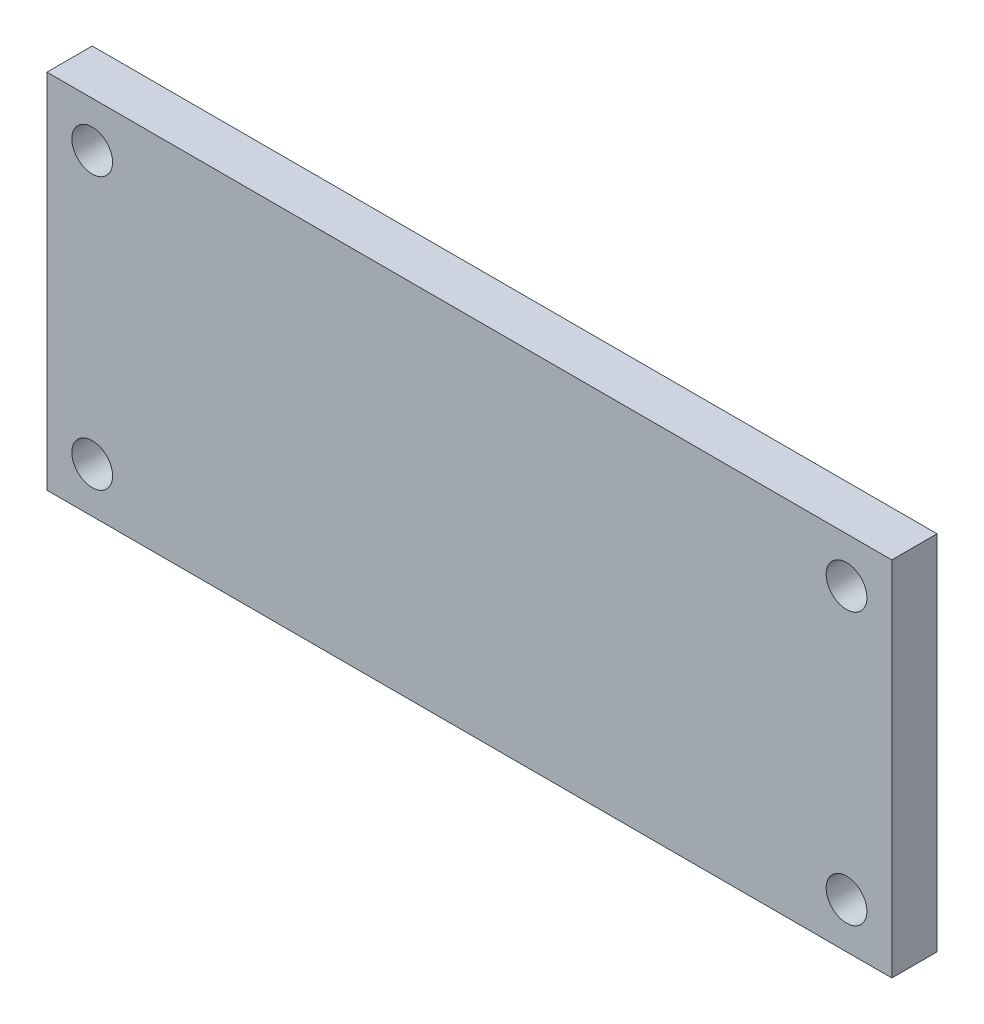
ISO-10303-21;
HEADER;
FILE_DESCRIPTION(('STEP AP214'),'2;1');
FILE_NAME('part.step','',(''),(''),'','','');
FILE_SCHEMA(('AUTOMOTIVE_DESIGN { 1 0 10303 214 1 1 1 1 }'));
ENDSEC;
DATA;
#1=APPLICATION_CONTEXT('core data for automotive mechanical design processes');
#2=APPLICATION_PROTOCOL_DEFINITION('international standard','automotive_design',2000,#1);
#3=PRODUCT_CONTEXT('',#1,'mechanical');
#4=PRODUCT('Part','Part','',(#3));
#5=PRODUCT_RELATED_PRODUCT_CATEGORY('part','',(#4));
#6=PRODUCT_DEFINITION_FORMATION('','',#4);
#7=PRODUCT_DEFINITION_CONTEXT('part definition',#1,'design');
#8=PRODUCT_DEFINITION('design','',#6,#7);
#9=PRODUCT_DEFINITION_SHAPE('','',#8);
#10=(LENGTH_UNIT() NAMED_UNIT(*) SI_UNIT(.MILLI.,.METRE.));
#11=(NAMED_UNIT(*) PLANE_ANGLE_UNIT() SI_UNIT($,.RADIAN.));
#12=(NAMED_UNIT(*) SI_UNIT($,.STERADIAN.) SOLID_ANGLE_UNIT());
#13=UNCERTAINTY_MEASURE_WITH_UNIT(LENGTH_MEASURE(1.E-05),#10,'distance_accuracy_value','');
#14=(GEOMETRIC_REPRESENTATION_CONTEXT(3) GLOBAL_UNCERTAINTY_ASSIGNED_CONTEXT((#13)) GLOBAL_UNIT_ASSIGNED_CONTEXT((#10,
#11,#12)) REPRESENTATION_CONTEXT('',''));
#15=CARTESIAN_POINT('',(0.,0.,0.));
#16=DIRECTION('',(0.,0.,1.));
#17=DIRECTION('',(1.,0.,0.));
#18=AXIS2_PLACEMENT_3D('',#15,#16,#17);
#19=CARTESIAN_POINT('',(-125.,45.,15.));
#20=DIRECTION('',(0.,0.,-1.));
#21=DIRECTION('',(-1.,0.,0.));
#22=AXIS2_PLACEMENT_3D('',#19,#20,#21);
#23=CYLINDRICAL_SURFACE('',#22,4.25000000000001);
#24=CARTESIAN_POINT('',(-125.,45.,1.99999999999995));
#25=DIRECTION('',(0.,0.,1.));
#26=DIRECTION('',(1.,0.,0.));
#27=AXIS2_PLACEMENT_3D('',#24,#25,#26);
#28=CIRCLE('',#27,4.25000000000001);
#29=CARTESIAN_POINT('',(-120.75,45.,1.99999999999995));
#30=VERTEX_POINT('',#29);
#31=EDGE_CURVE('E111',#30,#30,#28,.T.);
#32=ORIENTED_EDGE('',*,*,#31,.T.);
#33=EDGE_LOOP('',(#32));
#34=FACE_BOUND('',#33,.T.);
#35=CARTESIAN_POINT('',(-125.,45.,0.));
#36=DIRECTION('',(0.,0.,1.));
#37=DIRECTION('',(1.,0.,0.));
#38=AXIS2_PLACEMENT_3D('',#35,#36,#37);
#39=CIRCLE('',#38,4.25000000000001);
#40=CARTESIAN_POINT('',(-120.75,45.,0.));
#41=VERTEX_POINT('',#40);
#42=EDGE_CURVE('E104',#41,#41,#39,.T.);
#43=ORIENTED_EDGE('',*,*,#42,.F.);
#44=EDGE_LOOP('',(#43));
#45=FACE_BOUND('',#44,.T.);
#46=ADVANCED_FACE('F33',(#34,#45),#23,.F.);
#47=CARTESIAN_POINT('',(125.,45.,15.));
#48=DIRECTION('',(0.,0.,-1.));
#49=DIRECTION('',(-1.,0.,0.));
#50=AXIS2_PLACEMENT_3D('',#47,#48,#49);
#51=CYLINDRICAL_SURFACE('',#50,4.25000000000001);
#52=CARTESIAN_POINT('',(125.,45.,1.99999999999995));
#53=DIRECTION('',(0.,0.,1.));
#54=DIRECTION('',(1.,0.,0.));
#55=AXIS2_PLACEMENT_3D('',#52,#53,#54);
#56=CIRCLE('',#55,4.25000000000001);
#57=CARTESIAN_POINT('',(129.25,45.,1.99999999999995));
#58=VERTEX_POINT('',#57);
#59=EDGE_CURVE('E117',#58,#58,#56,.T.);
#60=ORIENTED_EDGE('',*,*,#59,.T.);
#61=EDGE_LOOP('',(#60));
#62=FACE_BOUND('',#61,.T.);
#63=CARTESIAN_POINT('',(125.,45.,0.));
#64=DIRECTION('',(0.,0.,1.));
#65=DIRECTION('',(1.,0.,0.));
#66=AXIS2_PLACEMENT_3D('',#63,#64,#65);
#67=CIRCLE('',#66,4.25000000000001);
#68=CARTESIAN_POINT('',(129.25,45.,0.));
#69=VERTEX_POINT('',#68);
#70=EDGE_CURVE('E150',#69,#69,#67,.T.);
#71=ORIENTED_EDGE('',*,*,#70,.F.);
#72=EDGE_LOOP('',(#71));
#73=FACE_BOUND('',#72,.T.);
#74=ADVANCED_FACE('F144',(#62,#73),#51,.F.);
#75=CARTESIAN_POINT('',(125.000000000001,-45.,15.));
#76=DIRECTION('',(0.,0.,-1.));
#77=DIRECTION('',(-1.,0.,0.));
#78=AXIS2_PLACEMENT_3D('',#75,#76,#77);
#79=CYLINDRICAL_SURFACE('',#78,4.25000000000001);
#80=CARTESIAN_POINT('',(125.000000000001,-45.,1.99999999999995));
#81=DIRECTION('',(0.,0.,1.));
#82=DIRECTION('',(1.,0.,0.));
#83=AXIS2_PLACEMENT_3D('',#80,#81,#82);
#84=CIRCLE('',#83,4.25000000000001);
#85=CARTESIAN_POINT('',(129.250000000001,-45.,1.99999999999995));
#86=VERTEX_POINT('',#85);
#87=EDGE_CURVE('E120',#86,#86,#84,.T.);
#88=ORIENTED_EDGE('',*,*,#87,.T.);
#89=EDGE_LOOP('',(#88));
#90=FACE_BOUND('',#89,.T.);
#91=CARTESIAN_POINT('',(125.000000000001,-45.,0.));
#92=DIRECTION('',(0.,0.,1.));
#93=DIRECTION('',(1.,0.,0.));
#94=AXIS2_PLACEMENT_3D('',#91,#92,#93);
#95=CIRCLE('',#94,4.25000000000001);
#96=CARTESIAN_POINT('',(129.250000000001,-45.,0.));
#97=VERTEX_POINT('',#96);
#98=EDGE_CURVE('E148',#97,#97,#95,.T.);
#99=ORIENTED_EDGE('',*,*,#98,.F.);
#100=EDGE_LOOP('',(#99));
#101=FACE_BOUND('',#100,.T.);
#102=ADVANCED_FACE('F140',(#90,#101),#79,.F.);
#103=CARTESIAN_POINT('',(-124.999999999999,-45.,15.));
#104=DIRECTION('',(0.,0.,-1.));
#105=DIRECTION('',(-1.,0.,0.));
#106=AXIS2_PLACEMENT_3D('',#103,#104,#105);
#107=CYLINDRICAL_SURFACE('',#106,4.25000000000001);
#108=CARTESIAN_POINT('',(-124.999999999999,-45.,1.99999999999995));
#109=DIRECTION('',(0.,0.,1.));
#110=DIRECTION('',(1.,0.,0.));
#111=AXIS2_PLACEMENT_3D('',#108,#109,#110);
#112=CIRCLE('',#111,4.25000000000001);
#113=CARTESIAN_POINT('',(-120.749999999999,-45.,1.99999999999995));
#114=VERTEX_POINT('',#113);
#115=EDGE_CURVE('E123',#114,#114,#112,.T.);
#116=ORIENTED_EDGE('',*,*,#115,.T.);
#117=EDGE_LOOP('',(#116));
#118=FACE_BOUND('',#117,.T.);
#119=CARTESIAN_POINT('',(-124.999999999999,-45.,0.));
#120=DIRECTION('',(0.,0.,1.));
#121=DIRECTION('',(1.,0.,0.));
#122=AXIS2_PLACEMENT_3D('',#119,#120,#121);
#123=CIRCLE('',#122,4.25000000000001);
#124=CARTESIAN_POINT('',(-120.749999999999,-45.,0.));
#125=VERTEX_POINT('',#124);
#126=EDGE_CURVE('E151',#125,#125,#123,.T.);
#127=ORIENTED_EDGE('',*,*,#126,.F.);
#128=EDGE_LOOP('',(#127));
#129=FACE_BOUND('',#128,.T.);
#130=ADVANCED_FACE('F143',(#118,#129),#107,.F.);
#131=CARTESIAN_POINT('',(0.,0.,15.));
#132=DIRECTION('',(0.,0.,-1.));
#133=DIRECTION('',(-1.,0.,0.));
#134=AXIS2_PLACEMENT_3D('',#131,#132,#133);
#135=PLANE('',#134);
#136=CARTESIAN_POINT('',(-124.999999999999,-45.,15.));
#137=DIRECTION('',(0.,0.,1.));
#138=DIRECTION('',(1.,0.,0.));
#139=AXIS2_PLACEMENT_3D('',#136,#137,#138);
#140=CIRCLE('',#139,6.75);
#141=CARTESIAN_POINT('',(-118.249999999999,-45.,15.));
#142=VERTEX_POINT('',#141);
#143=EDGE_CURVE('E238',#142,#142,#140,.T.);
#144=ORIENTED_EDGE('',*,*,#143,.F.);
#145=EDGE_LOOP('',(#144));
#146=FACE_BOUND('',#145,.T.);
#147=CARTESIAN_POINT('',(125.000000000001,-45.,15.));
#148=DIRECTION('',(0.,0.,1.));
#149=DIRECTION('',(1.,0.,0.));
#150=AXIS2_PLACEMENT_3D('',#147,#148,#149);
#151=CIRCLE('',#150,6.75);
#152=CARTESIAN_POINT('',(131.750000000001,-45.,15.));
#153=VERTEX_POINT('',#152);
#154=EDGE_CURVE('E234',#153,#153,#151,.T.);
#155=ORIENTED_EDGE('',*,*,#154,.F.);
#156=EDGE_LOOP('',(#155));
#157=FACE_BOUND('',#156,.T.);
#158=CARTESIAN_POINT('',(125.,45.,15.));
#159=DIRECTION('',(0.,0.,1.));
#160=DIRECTION('',(1.,0.,0.));
#161=AXIS2_PLACEMENT_3D('',#158,#159,#160);
#162=CIRCLE('',#161,6.75);
#163=CARTESIAN_POINT('',(131.75,45.,15.));
#164=VERTEX_POINT('',#163);
#165=EDGE_CURVE('E232',#164,#164,#162,.T.);
#166=ORIENTED_EDGE('',*,*,#165,.F.);
#167=EDGE_LOOP('',(#166));
#168=FACE_BOUND('',#167,.T.);
#169=CARTESIAN_POINT('',(-125.,45.,15.));
#170=DIRECTION('',(0.,0.,1.));
#171=DIRECTION('',(1.,0.,0.));
#172=AXIS2_PLACEMENT_3D('',#169,#170,#171);
#173=CIRCLE('',#172,6.75);
#174=CARTESIAN_POINT('',(-118.25,45.,15.));
#175=VERTEX_POINT('',#174);
#176=EDGE_CURVE('E156',#175,#175,#173,.T.);
#177=ORIENTED_EDGE('',*,*,#176,.F.);
#178=EDGE_LOOP('',(#177));
#179=FACE_BOUND('',#178,.T.);
#180=DIRECTION('',(0.,1.,0.));
#181=VECTOR('',#180,1.);
#182=CARTESIAN_POINT('',(140.,-60.,15.));
#183=LINE('',#182,#181);
#184=CARTESIAN_POINT('',(140.,-60.,15.));
#185=VERTEX_POINT('',#184);
#186=CARTESIAN_POINT('',(140.,60.,15.));
#187=VERTEX_POINT('',#186);
#188=EDGE_CURVE('E86',#185,#187,#183,.T.);
#189=ORIENTED_EDGE('',*,*,#188,.T.);
#190=DIRECTION('',(-1.,0.,0.));
#191=VECTOR('',#190,1.);
#192=CARTESIAN_POINT('',(-140.,60.,15.));
#193=LINE('',#192,#191);
#194=CARTESIAN_POINT('',(-140.,60.,15.));
#195=VERTEX_POINT('',#194);
#196=EDGE_CURVE('E81',#187,#195,#193,.T.);
#197=ORIENTED_EDGE('',*,*,#196,.T.);
#198=DIRECTION('',(0.,-1.,0.));
#199=VECTOR('',#198,1.);
#200=CARTESIAN_POINT('',(-140.,-60.,15.));
#201=LINE('',#200,#199);
#202=CARTESIAN_POINT('',(-140.,-60.,15.));
#203=VERTEX_POINT('',#202);
#204=EDGE_CURVE('E84',#195,#203,#201,.T.);
#205=ORIENTED_EDGE('',*,*,#204,.T.);
#206=DIRECTION('',(1.,0.,0.));
#207=VECTOR('',#206,1.);
#208=CARTESIAN_POINT('',(-140.,-60.,15.));
#209=LINE('',#208,#207);
#210=EDGE_CURVE('E50',#203,#185,#209,.T.);
#211=ORIENTED_EDGE('',*,*,#210,.T.);
#212=EDGE_LOOP('',(#189,#197,#205,#211));
#213=FACE_BOUND('',#212,.T.);
#214=ADVANCED_FACE('F82',(#146,#157,#168,#179,#213),#135,.F.);
#215=CARTESIAN_POINT('',(0.,0.,0.));
#216=DIRECTION('',(0.,0.,-1.));
#217=DIRECTION('',(-1.,0.,0.));
#218=AXIS2_PLACEMENT_3D('',#215,#216,#217);
#219=PLANE('',#218);
#220=ORIENTED_EDGE('',*,*,#98,.T.);
#221=EDGE_LOOP('',(#220));
#222=FACE_BOUND('',#221,.T.);
#223=ORIENTED_EDGE('',*,*,#42,.T.);
#224=EDGE_LOOP('',(#223));
#225=FACE_BOUND('',#224,.T.);
#226=DIRECTION('',(0.,1.,0.));
#227=VECTOR('',#226,1.);
#228=CARTESIAN_POINT('',(140.,-60.,0.));
#229=LINE('',#228,#227);
#230=CARTESIAN_POINT('',(140.,-60.,0.));
#231=VERTEX_POINT('',#230);
#232=CARTESIAN_POINT('',(140.,60.,0.));
#233=VERTEX_POINT('',#232);
#234=EDGE_CURVE('E101',#231,#233,#229,.T.);
#235=ORIENTED_EDGE('',*,*,#234,.F.);
#236=DIRECTION('',(1.,0.,0.));
#237=VECTOR('',#236,1.);
#238=CARTESIAN_POINT('',(-140.,-60.,0.));
#239=LINE('',#238,#237);
#240=CARTESIAN_POINT('',(-140.,-60.,0.));
#241=VERTEX_POINT('',#240);
#242=EDGE_CURVE('E73',#241,#231,#239,.T.);
#243=ORIENTED_EDGE('',*,*,#242,.F.);
#244=DIRECTION('',(0.,-1.,0.));
#245=VECTOR('',#244,1.);
#246=CARTESIAN_POINT('',(-140.,-60.,0.));
#247=LINE('',#246,#245);
#248=CARTESIAN_POINT('',(-140.,60.,0.));
#249=VERTEX_POINT('',#248);
#250=EDGE_CURVE('E67',#249,#241,#247,.T.);
#251=ORIENTED_EDGE('',*,*,#250,.F.);
#252=DIRECTION('',(-1.,0.,0.));
#253=VECTOR('',#252,1.);
#254=CARTESIAN_POINT('',(-140.,60.,0.));
#255=LINE('',#254,#253);
#256=EDGE_CURVE('E91',#233,#249,#255,.T.);
#257=ORIENTED_EDGE('',*,*,#256,.F.);
#258=EDGE_LOOP('',(#235,#243,#251,#257));
#259=FACE_BOUND('',#258,.T.);
#260=ORIENTED_EDGE('',*,*,#70,.T.);
#261=EDGE_LOOP('',(#260));
#262=FACE_BOUND('',#261,.T.);
#263=ORIENTED_EDGE('',*,*,#126,.T.);
#264=EDGE_LOOP('',(#263));
#265=FACE_BOUND('',#264,.T.);
#266=ADVANCED_FACE('F163',(#222,#225,#259,#262,#265),#219,.T.);
#267=CARTESIAN_POINT('',(140.,-60.,15.));
#268=DIRECTION('',(-1.,0.,0.));
#269=DIRECTION('',(0.,0.,1.));
#270=AXIS2_PLACEMENT_3D('',#267,#268,#269);
#271=PLANE('',#270);
#272=ORIENTED_EDGE('',*,*,#234,.T.);
#273=DIRECTION('',(0.,0.,-1.));
#274=VECTOR('',#273,1.);
#275=CARTESIAN_POINT('',(140.,60.,15.));
#276=LINE('',#275,#274);
#277=EDGE_CURVE('E92',#187,#233,#276,.T.);
#278=ORIENTED_EDGE('',*,*,#277,.F.);
#279=ORIENTED_EDGE('',*,*,#188,.F.);
#280=DIRECTION('',(0.,0.,-1.));
#281=VECTOR('',#280,1.);
#282=CARTESIAN_POINT('',(140.,-60.,15.));
#283=LINE('',#282,#281);
#284=EDGE_CURVE('E97',#185,#231,#283,.T.);
#285=ORIENTED_EDGE('',*,*,#284,.T.);
#286=EDGE_LOOP('',(#272,#278,#279,#285));
#287=FACE_BOUND('',#286,.T.);
#288=ADVANCED_FACE('F180',(#287),#271,.F.);
#289=CARTESIAN_POINT('',(-140.,60.,15.));
#290=DIRECTION('',(0.,-1.,0.));
#291=DIRECTION('',(0.,0.,-1.));
#292=AXIS2_PLACEMENT_3D('',#289,#290,#291);
#293=PLANE('',#292);
#294=ORIENTED_EDGE('',*,*,#256,.T.);
#295=DIRECTION('',(0.,0.,-1.));
#296=VECTOR('',#295,1.);
#297=CARTESIAN_POINT('',(-140.,60.,15.));
#298=LINE('',#297,#296);
#299=EDGE_CURVE('E89',#195,#249,#298,.T.);
#300=ORIENTED_EDGE('',*,*,#299,.F.);
#301=ORIENTED_EDGE('',*,*,#196,.F.);
#302=ORIENTED_EDGE('',*,*,#277,.T.);
#303=EDGE_LOOP('',(#294,#300,#301,#302));
#304=FACE_BOUND('',#303,.T.);
#305=ADVANCED_FACE('F90',(#304),#293,.F.);
#306=CARTESIAN_POINT('',(-140.,-60.,15.));
#307=DIRECTION('',(1.,0.,0.));
#308=DIRECTION('',(0.,1.,0.));
#309=AXIS2_PLACEMENT_3D('',#306,#307,#308);
#310=PLANE('',#309);
#311=ORIENTED_EDGE('',*,*,#250,.T.);
#312=DIRECTION('',(0.,0.,-1.));
#313=VECTOR('',#312,1.);
#314=CARTESIAN_POINT('',(-140.,-60.,15.));
#315=LINE('',#314,#313);
#316=EDGE_CURVE('E93',#203,#241,#315,.T.);
#317=ORIENTED_EDGE('',*,*,#316,.F.);
#318=ORIENTED_EDGE('',*,*,#204,.F.);
#319=ORIENTED_EDGE('',*,*,#299,.T.);
#320=EDGE_LOOP('',(#311,#317,#318,#319));
#321=FACE_BOUND('',#320,.T.);
#322=ADVANCED_FACE('F95',(#321),#310,.F.);
#323=CARTESIAN_POINT('',(-140.,-60.,15.));
#324=DIRECTION('',(0.,1.,0.));
#325=DIRECTION('',(0.,0.,1.));
#326=AXIS2_PLACEMENT_3D('',#323,#324,#325);
#327=PLANE('',#326);
#328=ORIENTED_EDGE('',*,*,#242,.T.);
#329=ORIENTED_EDGE('',*,*,#284,.F.);
#330=ORIENTED_EDGE('',*,*,#210,.F.);
#331=ORIENTED_EDGE('',*,*,#316,.T.);
#332=EDGE_LOOP('',(#328,#329,#330,#331));
#333=FACE_BOUND('',#332,.T.);
#334=ADVANCED_FACE('F181',(#333),#327,.F.);
#335=CARTESIAN_POINT('',(-124.999999999999,-45.,5.));
#336=DIRECTION('',(0.,0.,1.));
#337=DIRECTION('',(1.,0.,0.));
#338=AXIS2_PLACEMENT_3D('',#335,#336,#337);
#339=CYLINDRICAL_SURFACE('',#338,6.75);
#340=CARTESIAN_POINT('',(-124.999999999999,-45.,4.49999999999996));
#341=DIRECTION('',(0.,0.,1.));
#342=DIRECTION('',(1.,0.,0.));
#343=AXIS2_PLACEMENT_3D('',#340,#341,#342);
#344=CIRCLE('',#343,6.75);
#345=CARTESIAN_POINT('',(-118.249999999999,-45.,4.49999999999996));
#346=VERTEX_POINT('',#345);
#347=EDGE_CURVE('E11',#346,#346,#344,.F.);
#348=ORIENTED_EDGE('',*,*,#347,.T.);
#349=EDGE_LOOP('',(#348));
#350=FACE_BOUND('',#349,.T.);
#351=ORIENTED_EDGE('',*,*,#143,.T.);
#352=EDGE_LOOP('',(#351));
#353=FACE_BOUND('',#352,.T.);
#354=ADVANCED_FACE('F184',(#350,#353),#339,.F.);
#355=CARTESIAN_POINT('',(125.000000000001,-45.,5.));
#356=DIRECTION('',(0.,0.,1.));
#357=DIRECTION('',(1.,0.,0.));
#358=AXIS2_PLACEMENT_3D('',#355,#356,#357);
#359=CYLINDRICAL_SURFACE('',#358,6.75);
#360=CARTESIAN_POINT('',(125.000000000001,-45.,4.49999999999996));
#361=DIRECTION('',(0.,0.,1.));
#362=DIRECTION('',(1.,0.,0.));
#363=AXIS2_PLACEMENT_3D('',#360,#361,#362);
#364=CIRCLE('',#363,6.75);
#365=CARTESIAN_POINT('',(131.750000000001,-45.,4.49999999999996));
#366=VERTEX_POINT('',#365);
#367=EDGE_CURVE('E42',#366,#366,#364,.F.);
#368=ORIENTED_EDGE('',*,*,#367,.T.);
#369=EDGE_LOOP('',(#368));
#370=FACE_BOUND('',#369,.T.);
#371=ORIENTED_EDGE('',*,*,#154,.T.);
#372=EDGE_LOOP('',(#371));
#373=FACE_BOUND('',#372,.T.);
#374=ADVANCED_FACE('F131',(#370,#373),#359,.F.);
#375=CARTESIAN_POINT('',(125.,45.,5.));
#376=DIRECTION('',(0.,0.,1.));
#377=DIRECTION('',(1.,0.,0.));
#378=AXIS2_PLACEMENT_3D('',#375,#376,#377);
#379=CYLINDRICAL_SURFACE('',#378,6.75);
#380=CARTESIAN_POINT('',(125.,45.,4.49999999999996));
#381=DIRECTION('',(0.,0.,1.));
#382=DIRECTION('',(1.,0.,0.));
#383=AXIS2_PLACEMENT_3D('',#380,#381,#382);
#384=CIRCLE('',#383,6.75);
#385=CARTESIAN_POINT('',(131.75,45.,4.49999999999996));
#386=VERTEX_POINT('',#385);
#387=EDGE_CURVE('E126',#386,#386,#384,.F.);
#388=ORIENTED_EDGE('',*,*,#387,.T.);
#389=EDGE_LOOP('',(#388));
#390=FACE_BOUND('',#389,.T.);
#391=ORIENTED_EDGE('',*,*,#165,.T.);
#392=EDGE_LOOP('',(#391));
#393=FACE_BOUND('',#392,.T.);
#394=ADVANCED_FACE('F218',(#390,#393),#379,.F.);
#395=CARTESIAN_POINT('',(-125.,45.,5.));
#396=DIRECTION('',(0.,0.,1.));
#397=DIRECTION('',(1.,0.,0.));
#398=AXIS2_PLACEMENT_3D('',#395,#396,#397);
#399=CYLINDRICAL_SURFACE('',#398,6.75);
#400=CARTESIAN_POINT('',(-125.,45.,4.49999999999996));
#401=DIRECTION('',(0.,0.,1.));
#402=DIRECTION('',(1.,0.,0.));
#403=AXIS2_PLACEMENT_3D('',#400,#401,#402);
#404=CIRCLE('',#403,6.75);
#405=CARTESIAN_POINT('',(-118.25,45.,4.49999999999996));
#406=VERTEX_POINT('',#405);
#407=EDGE_CURVE('E114',#406,#406,#404,.F.);
#408=ORIENTED_EDGE('',*,*,#407,.T.);
#409=EDGE_LOOP('',(#408));
#410=FACE_BOUND('',#409,.T.);
#411=ORIENTED_EDGE('',*,*,#176,.T.);
#412=EDGE_LOOP('',(#411));
#413=FACE_BOUND('',#412,.T.);
#414=ADVANCED_FACE('F195',(#410,#413),#399,.F.);
#415=CARTESIAN_POINT('',(-125.,45.,1.99999999999995));
#416=DIRECTION('',(0.,0.,1.));
#417=DIRECTION('',(1.,0.,0.));
#418=AXIS2_PLACEMENT_3D('',#415,#416,#417);
#419=CONICAL_SURFACE('',#418,4.25000000000001,0.785398163397444);
#420=ORIENTED_EDGE('',*,*,#407,.F.);
#421=EDGE_LOOP('',(#420));
#422=FACE_BOUND('',#421,.T.);
#423=ORIENTED_EDGE('',*,*,#31,.F.);
#424=EDGE_LOOP('',(#423));
#425=FACE_BOUND('',#424,.T.);
#426=ADVANCED_FACE('F192',(#422,#425),#419,.F.);
#427=CARTESIAN_POINT('',(125.,45.,1.99999999999995));
#428=DIRECTION('',(0.,0.,1.));
#429=DIRECTION('',(1.,0.,0.));
#430=AXIS2_PLACEMENT_3D('',#427,#428,#429);
#431=CONICAL_SURFACE('',#430,4.25000000000001,0.785398163397444);
#432=ORIENTED_EDGE('',*,*,#387,.F.);
#433=EDGE_LOOP('',(#432));
#434=FACE_BOUND('',#433,.T.);
#435=ORIENTED_EDGE('',*,*,#59,.F.);
#436=EDGE_LOOP('',(#435));
#437=FACE_BOUND('',#436,.T.);
#438=ADVANCED_FACE('F137',(#434,#437),#431,.F.);
#439=CARTESIAN_POINT('',(125.000000000001,-45.,1.99999999999995));
#440=DIRECTION('',(0.,0.,1.));
#441=DIRECTION('',(1.,0.,0.));
#442=AXIS2_PLACEMENT_3D('',#439,#440,#441);
#443=CONICAL_SURFACE('',#442,4.25000000000001,0.785398163397444);
#444=ORIENTED_EDGE('',*,*,#367,.F.);
#445=EDGE_LOOP('',(#444));
#446=FACE_BOUND('',#445,.T.);
#447=ORIENTED_EDGE('',*,*,#87,.F.);
#448=EDGE_LOOP('',(#447));
#449=FACE_BOUND('',#448,.T.);
#450=ADVANCED_FACE('F134',(#446,#449),#443,.F.);
#451=CARTESIAN_POINT('',(-124.999999999999,-45.,1.99999999999995));
#452=DIRECTION('',(0.,0.,1.));
#453=DIRECTION('',(1.,0.,0.));
#454=AXIS2_PLACEMENT_3D('',#451,#452,#453);
#455=CONICAL_SURFACE('',#454,4.25000000000001,0.785398163397444);
#456=ORIENTED_EDGE('',*,*,#347,.F.);
#457=EDGE_LOOP('',(#456));
#458=FACE_BOUND('',#457,.T.);
#459=ORIENTED_EDGE('',*,*,#115,.F.);
#460=EDGE_LOOP('',(#459));
#461=FACE_BOUND('',#460,.T.);
#462=ADVANCED_FACE('F35',(#458,#461),#455,.F.);
#463=CLOSED_SHELL('',(#46,#74,#102,#130,#214,#266,#288,#305,#322,#334,#354,#374,#394,#414,#426,
#438,#450,#462));
#464=MANIFOLD_SOLID_BREP('B2',#463);
#465=ADVANCED_BREP_SHAPE_REPRESENTATION('',(#18,#464),#14);
#466=SHAPE_DEFINITION_REPRESENTATION(#9,#465);
ENDSEC;
END-ISO-10303-21;
